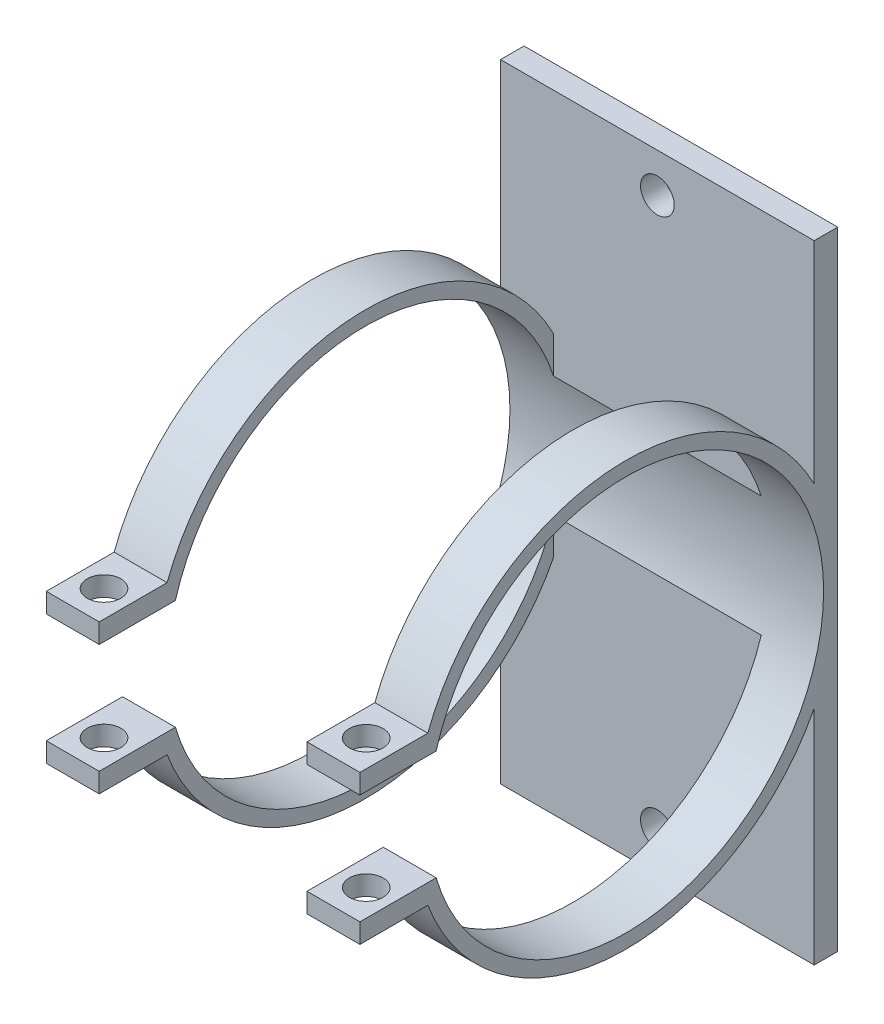
ISO-10303-21;
HEADER;
FILE_DESCRIPTION(('STEP AP214'),'2;1');
FILE_NAME('part.step','',(''),(''),'','','');
FILE_SCHEMA(('AUTOMOTIVE_DESIGN { 1 0 10303 214 1 1 1 1 }'));
ENDSEC;
DATA;
#1=APPLICATION_CONTEXT('core data for automotive mechanical design processes');
#2=APPLICATION_PROTOCOL_DEFINITION('international standard','automotive_design',2000,#1);
#3=PRODUCT_CONTEXT('',#1,'mechanical');
#4=PRODUCT('Part','Part','',(#3));
#5=PRODUCT_RELATED_PRODUCT_CATEGORY('part','',(#4));
#6=PRODUCT_DEFINITION_FORMATION('','',#4);
#7=PRODUCT_DEFINITION_CONTEXT('part definition',#1,'design');
#8=PRODUCT_DEFINITION('design','',#6,#7);
#9=PRODUCT_DEFINITION_SHAPE('','',#8);
#10=(LENGTH_UNIT() NAMED_UNIT(*) SI_UNIT(.MILLI.,.METRE.));
#11=(NAMED_UNIT(*) PLANE_ANGLE_UNIT() SI_UNIT($,.RADIAN.));
#12=(NAMED_UNIT(*) SI_UNIT($,.STERADIAN.) SOLID_ANGLE_UNIT());
#13=UNCERTAINTY_MEASURE_WITH_UNIT(LENGTH_MEASURE(1.E-05),#10,'distance_accuracy_value','');
#14=(GEOMETRIC_REPRESENTATION_CONTEXT(3) GLOBAL_UNCERTAINTY_ASSIGNED_CONTEXT((#13)) GLOBAL_UNIT_ASSIGNED_CONTEXT((#10,
#11,#12)) REPRESENTATION_CONTEXT('',''));
#15=CARTESIAN_POINT('',(0.,0.,0.));
#16=DIRECTION('',(0.,0.,1.));
#17=DIRECTION('',(1.,0.,0.));
#18=AXIS2_PLACEMENT_3D('',#15,#16,#17);
#19=CARTESIAN_POINT('',(121.416821240045,47.7428456543323,51.2082630521068));
#20=DIRECTION('',(0.,-1.,0.));
#21=DIRECTION('',(0.,0.,-1.));
#22=AXIS2_PLACEMENT_3D('',#19,#20,#21);
#23=PLANE('',#22);
#24=CARTESIAN_POINT('',(36.625,47.7428456543323,56.7542231600176));
#25=DIRECTION('',(0.,-1.,0.));
#26=DIRECTION('',(0.,0.,-1.));
#27=AXIS2_PLACEMENT_3D('',#24,#25,#26);
#28=CIRCLE('',#27,2.15);
#29=CARTESIAN_POINT('',(36.625,47.7428456543323,54.6042231600176));
#30=VERTEX_POINT('',#29);
#31=EDGE_CURVE('E331',#30,#30,#28,.T.);
#32=ORIENTED_EDGE('',*,*,#31,.F.);
#33=EDGE_LOOP('',(#32));
#34=FACE_BOUND('',#33,.T.);
#35=DIRECTION('',(0.,0.,1.));
#36=VECTOR('',#35,1.);
#37=CARTESIAN_POINT('',(33.25,47.7428456543323,51.2082630521068));
#38=LINE('',#37,#36);
#39=CARTESIAN_POINT('',(33.25,47.7428456543323,51.2082630521068));
#40=VERTEX_POINT('',#39);
#41=CARTESIAN_POINT('',(33.25,47.7428456543323,60.9319192282131));
#42=VERTEX_POINT('',#41);
#43=EDGE_CURVE('E379',#40,#42,#38,.T.);
#44=ORIENTED_EDGE('',*,*,#43,.F.);
#45=DIRECTION('',(-1.,0.,0.));
#46=VECTOR('',#45,1.);
#47=CARTESIAN_POINT('',(121.416821240045,47.7428456543323,51.2082630521068));
#48=LINE('',#47,#46);
#49=CARTESIAN_POINT('',(40.,47.7428456543323,51.2082630521068));
#50=VERTEX_POINT('',#49);
#51=EDGE_CURVE('E483',#50,#40,#48,.T.);
#52=ORIENTED_EDGE('',*,*,#51,.F.);
#53=DIRECTION('',(0.,0.,-1.));
#54=VECTOR('',#53,1.);
#55=CARTESIAN_POINT('',(40.,47.7428456543323,51.2082630521068));
#56=LINE('',#55,#54);
#57=CARTESIAN_POINT('',(40.,47.7428456543323,60.9319192282131));
#58=VERTEX_POINT('',#57);
#59=EDGE_CURVE('E254',#58,#50,#56,.T.);
#60=ORIENTED_EDGE('',*,*,#59,.F.);
#61=DIRECTION('',(-1.,0.,0.));
#62=VECTOR('',#61,1.);
#63=CARTESIAN_POINT('',(121.416821240045,47.7428456543323,60.9319192282131));
#64=LINE('',#63,#62);
#65=EDGE_CURVE('E479',#58,#42,#64,.T.);
#66=ORIENTED_EDGE('',*,*,#65,.T.);
#67=EDGE_LOOP('',(#44,#52,#60,#66));
#68=FACE_BOUND('',#67,.T.);
#69=ADVANCED_FACE('F43',(#34,#68),#23,.T.);
#70=CARTESIAN_POINT('',(121.416821240045,47.7428456543323,60.9319192282131));
#71=DIRECTION('',(0.,0.,1.));
#72=DIRECTION('',(1.,0.,0.));
#73=AXIS2_PLACEMENT_3D('',#70,#71,#72);
#74=PLANE('',#73);
#75=DIRECTION('',(0.,1.,0.));
#76=VECTOR('',#75,1.);
#77=CARTESIAN_POINT('',(33.25,67.7428456543323,60.9319192282131));
#78=LINE('',#77,#76);
#79=CARTESIAN_POINT('',(33.25,50.2428456543322,60.9319192282131));
#80=VERTEX_POINT('',#79);
#81=EDGE_CURVE('E344',#42,#80,#78,.T.);
#82=ORIENTED_EDGE('',*,*,#81,.F.);
#83=ORIENTED_EDGE('',*,*,#65,.F.);
#84=DIRECTION('',(0.,-1.,0.));
#85=VECTOR('',#84,1.);
#86=CARTESIAN_POINT('',(40.,47.7428456543323,60.9319192282131));
#87=LINE('',#86,#85);
#88=CARTESIAN_POINT('',(40.,50.2428456543323,60.9319192282131));
#89=VERTEX_POINT('',#88);
#90=EDGE_CURVE('E395',#89,#58,#87,.T.);
#91=ORIENTED_EDGE('',*,*,#90,.F.);
#92=DIRECTION('',(-1.,0.,0.));
#93=VECTOR('',#92,1.);
#94=CARTESIAN_POINT('',(121.416821240045,50.2428456543323,60.9319192282131));
#95=LINE('',#94,#93);
#96=EDGE_CURVE('E474',#89,#80,#95,.T.);
#97=ORIENTED_EDGE('',*,*,#96,.T.);
#98=EDGE_LOOP('',(#82,#83,#91,#97));
#99=FACE_BOUND('',#98,.T.);
#100=ADVANCED_FACE('F533',(#99),#74,.T.);
#101=CARTESIAN_POINT('',(121.416821240045,50.2428456543323,60.9319192282131));
#102=DIRECTION('',(0.,1.,0.));
#103=DIRECTION('',(0.,0.,1.));
#104=AXIS2_PLACEMENT_3D('',#101,#102,#103);
#105=PLANE('',#104);
#106=CARTESIAN_POINT('',(36.625,50.2428456543323,56.7542231600176));
#107=DIRECTION('',(0.,1.,0.));
#108=DIRECTION('',(0.,0.,1.));
#109=AXIS2_PLACEMENT_3D('',#106,#107,#108);
#110=CIRCLE('',#109,2.15);
#111=CARTESIAN_POINT('',(36.625,50.2428456543323,58.9042231600176));
#112=VERTEX_POINT('',#111);
#113=EDGE_CURVE('E682',#112,#112,#110,.T.);
#114=ORIENTED_EDGE('',*,*,#113,.F.);
#115=EDGE_LOOP('',(#114));
#116=FACE_BOUND('',#115,.T.);
#117=DIRECTION('',(0.,0.,-1.));
#118=VECTOR('',#117,1.);
#119=CARTESIAN_POINT('',(33.25,50.2428456543323,60.9319192282131));
#120=LINE('',#119,#118);
#121=CARTESIAN_POINT('',(33.25,50.2428456543322,52.2735039122002));
#122=VERTEX_POINT('',#121);
#123=EDGE_CURVE('E385',#80,#122,#120,.T.);
#124=ORIENTED_EDGE('',*,*,#123,.F.);
#125=ORIENTED_EDGE('',*,*,#96,.F.);
#126=DIRECTION('',(0.,0.,1.));
#127=VECTOR('',#126,1.);
#128=CARTESIAN_POINT('',(40.,50.2428456543323,60.9319192282131));
#129=LINE('',#128,#127);
#130=CARTESIAN_POINT('',(40.,50.2428456543322,52.2735039122002));
#131=VERTEX_POINT('',#130);
#132=EDGE_CURVE('E398',#131,#89,#129,.T.);
#133=ORIENTED_EDGE('',*,*,#132,.F.);
#134=DIRECTION('',(-1.,0.,0.));
#135=VECTOR('',#134,1.);
#136=CARTESIAN_POINT('',(121.416821240045,50.2428456543322,52.2735039122002));
#137=LINE('',#136,#135);
#138=EDGE_CURVE('E470',#131,#122,#137,.T.);
#139=ORIENTED_EDGE('',*,*,#138,.T.);
#140=EDGE_LOOP('',(#124,#125,#133,#139));
#141=FACE_BOUND('',#140,.T.);
#142=ADVANCED_FACE('F537',(#116,#141),#105,.T.);
#143=CARTESIAN_POINT('',(121.416821240045,40.7428456543323,27.));
#144=DIRECTION('',(-1.,0.,0.));
#145=DIRECTION('',(0.,0.,1.));
#146=AXIS2_PLACEMENT_3D('',#143,#144,#145);
#147=CYLINDRICAL_SURFACE('',#146,27.);
#148=DIRECTION('',(-1.,0.,0.));
#149=VECTOR('',#148,1.);
#150=CARTESIAN_POINT('',(121.416821240045,53.1121625311852,3.));
#151=LINE('',#150,#149);
#152=CARTESIAN_POINT('',(33.25,53.1121625311852,3.));
#153=VERTEX_POINT('',#152);
#154=CARTESIAN_POINT('',(40.,53.1121625311852,3.));
#155=VERTEX_POINT('',#154);
#156=EDGE_CURVE('E248',#153,#155,#151,.F.);
#157=ORIENTED_EDGE('',*,*,#156,.F.);
#158=CARTESIAN_POINT('',(33.25,40.7428456543323,27.));
#159=DIRECTION('',(1.,0.,0.));
#160=DIRECTION('',(0.,1.,0.));
#161=AXIS2_PLACEMENT_3D('',#158,#159,#160);
#162=CIRCLE('',#161,27.);
#163=EDGE_CURVE('E382',#122,#153,#162,.F.);
#164=ORIENTED_EDGE('',*,*,#163,.F.);
#165=ORIENTED_EDGE('',*,*,#138,.F.);
#166=CARTESIAN_POINT('',(40.,40.7428456543323,27.));
#167=DIRECTION('',(-1.,0.,0.));
#168=DIRECTION('',(0.,0.,1.));
#169=AXIS2_PLACEMENT_3D('',#166,#167,#168);
#170=CIRCLE('',#169,27.);
#171=EDGE_CURVE('E402',#155,#131,#170,.F.);
#172=ORIENTED_EDGE('',*,*,#171,.F.);
#173=EDGE_LOOP('',(#157,#164,#165,#172));
#174=FACE_BOUND('',#173,.T.);
#175=ADVANCED_FACE('F542',(#174),#147,.T.);
#176=CARTESIAN_POINT('',(33.25,40.7428456543323,27.));
#177=DIRECTION('',(1.,0.,0.));
#178=DIRECTION('',(0.,1.,0.));
#179=AXIS2_PLACEMENT_3D('',#176,#177,#178);
#180=CIRCLE('',#179,27.);
#181=CARTESIAN_POINT('',(33.25,28.3735287774793,3.));
#182=VERTEX_POINT('',#181);
#183=CARTESIAN_POINT('',(33.25,31.2428456543323,52.2735039122002));
#184=VERTEX_POINT('',#183);
#185=EDGE_CURVE('E369',#182,#184,#180,.F.);
#186=ORIENTED_EDGE('',*,*,#185,.F.);
#187=DIRECTION('',(-1.,0.,0.));
#188=VECTOR('',#187,1.);
#189=CARTESIAN_POINT('',(121.416821240045,28.3735287774793,3.));
#190=LINE('',#189,#188);
#191=CARTESIAN_POINT('',(40.,28.3735287774793,3.));
#192=VERTEX_POINT('',#191);
#193=EDGE_CURVE('E252',#192,#182,#190,.T.);
#194=ORIENTED_EDGE('',*,*,#193,.F.);
#195=CARTESIAN_POINT('',(40.,31.2428456543323,52.2735039122002));
#196=VERTEX_POINT('',#195);
#197=EDGE_CURVE('E403',#196,#192,#170,.F.);
#198=ORIENTED_EDGE('',*,*,#197,.F.);
#199=DIRECTION('',(-1.,0.,0.));
#200=VECTOR('',#199,1.);
#201=CARTESIAN_POINT('',(121.416821240045,31.2428456543323,52.2735039122002));
#202=LINE('',#201,#200);
#203=EDGE_CURVE('E465',#196,#184,#202,.T.);
#204=ORIENTED_EDGE('',*,*,#203,.T.);
#205=EDGE_LOOP('',(#186,#194,#198,#204));
#206=FACE_BOUND('',#205,.T.);
#207=ADVANCED_FACE('F574',(#206),#147,.T.);
#208=CARTESIAN_POINT('',(121.416821240045,33.7428456543323,51.2082630521068));
#209=DIRECTION('',(0.,1.,0.));
#210=DIRECTION('',(0.,0.,1.));
#211=AXIS2_PLACEMENT_3D('',#208,#209,#210);
#212=PLANE('',#211);
#213=CARTESIAN_POINT('',(36.625,33.7428456543323,56.7542231600177));
#214=DIRECTION('',(0.,1.,0.));
#215=DIRECTION('',(0.,0.,1.));
#216=AXIS2_PLACEMENT_3D('',#213,#214,#215);
#217=CIRCLE('',#216,2.15);
#218=CARTESIAN_POINT('',(36.625,33.7428456543323,58.9042231600177));
#219=VERTEX_POINT('',#218);
#220=EDGE_CURVE('E337',#219,#219,#217,.T.);
#221=ORIENTED_EDGE('',*,*,#220,.F.);
#222=EDGE_LOOP('',(#221));
#223=FACE_BOUND('',#222,.T.);
#224=DIRECTION('',(0.,0.,-1.));
#225=VECTOR('',#224,1.);
#226=CARTESIAN_POINT('',(33.25,33.7428456543323,51.2082630521068));
#227=LINE('',#226,#225);
#228=CARTESIAN_POINT('',(33.25,33.7428456543323,60.9319192282131));
#229=VERTEX_POINT('',#228);
#230=CARTESIAN_POINT('',(33.25,33.7428456543323,51.2082630521068));
#231=VERTEX_POINT('',#230);
#232=EDGE_CURVE('E372',#229,#231,#227,.T.);
#233=ORIENTED_EDGE('',*,*,#232,.F.);
#234=DIRECTION('',(-1.,0.,0.));
#235=VECTOR('',#234,1.);
#236=CARTESIAN_POINT('',(121.416821240045,33.7428456543323,60.9319192282131));
#237=LINE('',#236,#235);
#238=CARTESIAN_POINT('',(40.,33.7428456543323,60.9319192282131));
#239=VERTEX_POINT('',#238);
#240=EDGE_CURVE('E455',#239,#229,#237,.T.);
#241=ORIENTED_EDGE('',*,*,#240,.F.);
#242=DIRECTION('',(0.,0.,1.));
#243=VECTOR('',#242,1.);
#244=CARTESIAN_POINT('',(40.,33.7428456543323,51.2082630521068));
#245=LINE('',#244,#243);
#246=CARTESIAN_POINT('',(40.,33.7428456543323,51.2082630521068));
#247=VERTEX_POINT('',#246);
#248=EDGE_CURVE('E413',#247,#239,#245,.T.);
#249=ORIENTED_EDGE('',*,*,#248,.F.);
#250=DIRECTION('',(-1.,0.,0.));
#251=VECTOR('',#250,1.);
#252=CARTESIAN_POINT('',(121.416821240045,33.7428456543323,51.2082630521068));
#253=LINE('',#252,#251);
#254=EDGE_CURVE('E399',#247,#231,#253,.T.);
#255=ORIENTED_EDGE('',*,*,#254,.T.);
#256=EDGE_LOOP('',(#233,#241,#249,#255));
#257=FACE_BOUND('',#256,.T.);
#258=ADVANCED_FACE('F621',(#223,#257),#212,.T.);
#259=CARTESIAN_POINT('',(121.416821240045,33.7428456543323,60.9319192282131));
#260=DIRECTION('',(0.,0.,1.));
#261=DIRECTION('',(1.,0.,0.));
#262=AXIS2_PLACEMENT_3D('',#259,#260,#261);
#263=PLANE('',#262);
#264=CARTESIAN_POINT('',(33.25,31.2428456543323,60.9319192282131));
#265=VERTEX_POINT('',#264);
#266=EDGE_CURVE('E347',#265,#229,#78,.T.);
#267=ORIENTED_EDGE('',*,*,#266,.F.);
#268=DIRECTION('',(-1.,0.,0.));
#269=VECTOR('',#268,1.);
#270=CARTESIAN_POINT('',(121.416821240045,31.2428456543323,60.9319192282131));
#271=LINE('',#270,#269);
#272=CARTESIAN_POINT('',(40.,31.2428456543323,60.9319192282131));
#273=VERTEX_POINT('',#272);
#274=EDGE_CURVE('E460',#273,#265,#271,.T.);
#275=ORIENTED_EDGE('',*,*,#274,.F.);
#276=DIRECTION('',(0.,-1.,0.));
#277=VECTOR('',#276,1.);
#278=CARTESIAN_POINT('',(40.,33.7428456543323,60.9319192282131));
#279=LINE('',#278,#277);
#280=EDGE_CURVE('E410',#239,#273,#279,.T.);
#281=ORIENTED_EDGE('',*,*,#280,.F.);
#282=ORIENTED_EDGE('',*,*,#240,.T.);
#283=EDGE_LOOP('',(#267,#275,#281,#282));
#284=FACE_BOUND('',#283,.T.);
#285=ADVANCED_FACE('F586',(#284),#263,.T.);
#286=CARTESIAN_POINT('',(121.416821240045,31.2428456543323,60.9319192282131));
#287=DIRECTION('',(0.,-1.,0.));
#288=DIRECTION('',(0.,0.,-1.));
#289=AXIS2_PLACEMENT_3D('',#286,#287,#288);
#290=PLANE('',#289);
#291=CARTESIAN_POINT('',(36.625,31.2428456543323,56.7542231600177));
#292=DIRECTION('',(0.,-1.,0.));
#293=DIRECTION('',(0.,0.,-1.));
#294=AXIS2_PLACEMENT_3D('',#291,#292,#293);
#295=CIRCLE('',#294,2.15);
#296=CARTESIAN_POINT('',(36.625,31.2428456543323,54.6042231600177));
#297=VERTEX_POINT('',#296);
#298=EDGE_CURVE('E47',#297,#297,#295,.T.);
#299=ORIENTED_EDGE('',*,*,#298,.F.);
#300=EDGE_LOOP('',(#299));
#301=FACE_BOUND('',#300,.T.);
#302=DIRECTION('',(0.,0.,1.));
#303=VECTOR('',#302,1.);
#304=CARTESIAN_POINT('',(33.25,31.2428456543323,60.9319192282131));
#305=LINE('',#304,#303);
#306=EDGE_CURVE('E11',#184,#265,#305,.T.);
#307=ORIENTED_EDGE('',*,*,#306,.F.);
#308=ORIENTED_EDGE('',*,*,#203,.F.);
#309=DIRECTION('',(0.,0.,-1.));
#310=VECTOR('',#309,1.);
#311=CARTESIAN_POINT('',(40.,31.2428456543323,60.9319192282131));
#312=LINE('',#311,#310);
#313=EDGE_CURVE('E407',#273,#196,#312,.T.);
#314=ORIENTED_EDGE('',*,*,#313,.F.);
#315=ORIENTED_EDGE('',*,*,#274,.T.);
#316=EDGE_LOOP('',(#307,#308,#314,#315));
#317=FACE_BOUND('',#316,.T.);
#318=ADVANCED_FACE('F581',(#301,#317),#290,.T.);
#319=CARTESIAN_POINT('',(0.,0.,3.));
#320=DIRECTION('',(0.,0.,-1.));
#321=DIRECTION('',(-1.,0.,0.));
#322=AXIS2_PLACEMENT_3D('',#319,#320,#321);
#323=PLANE('',#322);
#324=CARTESIAN_POINT('',(20.,5.,3.));
#325=DIRECTION('',(0.,0.,1.));
#326=DIRECTION('',(1.,0.,0.));
#327=AXIS2_PLACEMENT_3D('',#324,#325,#326);
#328=CIRCLE('',#327,2.15);
#329=CARTESIAN_POINT('',(22.15,5.,3.));
#330=VERTEX_POINT('',#329);
#331=EDGE_CURVE('E261',#330,#330,#328,.T.);
#332=ORIENTED_EDGE('',*,*,#331,.F.);
#333=EDGE_LOOP('',(#332));
#334=FACE_BOUND('',#333,.T.);
#335=ORIENTED_EDGE('',*,*,#193,.T.);
#336=DIRECTION('',(0.,1.,0.));
#337=VECTOR('',#336,1.);
#338=CARTESIAN_POINT('',(33.25,67.7428456543323,3.));
#339=LINE('',#338,#337);
#340=CARTESIAN_POINT('',(33.25,33.0590965694128,3.));
#341=VERTEX_POINT('',#340);
#342=EDGE_CURVE('E353',#182,#341,#339,.T.);
#343=ORIENTED_EDGE('',*,*,#342,.T.);
#344=DIRECTION('',(-1.,0.,0.));
#345=VECTOR('',#344,1.);
#346=CARTESIAN_POINT('',(121.416821240045,33.0590965694128,3.));
#347=LINE('',#346,#345);
#348=CARTESIAN_POINT('',(6.75000000000001,33.0590965694128,3.));
#349=VERTEX_POINT('',#348);
#350=EDGE_CURVE('E391',#341,#349,#347,.T.);
#351=ORIENTED_EDGE('',*,*,#350,.T.);
#352=DIRECTION('',(0.,-1.,0.));
#353=VECTOR('',#352,1.);
#354=CARTESIAN_POINT('',(6.75,67.7428456543323,3.));
#355=LINE('',#354,#353);
#356=CARTESIAN_POINT('',(6.75000000000001,28.3735287774793,3.));
#357=VERTEX_POINT('',#356);
#358=EDGE_CURVE('E239',#349,#357,#355,.T.);
#359=ORIENTED_EDGE('',*,*,#358,.T.);
#360=CARTESIAN_POINT('',(0.,28.3735287774793,3.));
#361=VERTEX_POINT('',#360);
#362=EDGE_CURVE('E247',#357,#361,#190,.T.);
#363=ORIENTED_EDGE('',*,*,#362,.T.);
#364=DIRECTION('',(0.,-1.,0.));
#365=VECTOR('',#364,1.);
#366=CARTESIAN_POINT('',(0.,0.,3.));
#367=LINE('',#366,#365);
#368=CARTESIAN_POINT('',(0.,0.,3.));
#369=VERTEX_POINT('',#368);
#370=EDGE_CURVE('E280',#361,#369,#367,.T.);
#371=ORIENTED_EDGE('',*,*,#370,.T.);
#372=DIRECTION('',(1.,0.,0.));
#373=VECTOR('',#372,1.);
#374=CARTESIAN_POINT('',(0.,0.,3.));
#375=LINE('',#374,#373);
#376=CARTESIAN_POINT('',(40.,0.,3.));
#377=VERTEX_POINT('',#376);
#378=EDGE_CURVE('E279',#369,#377,#375,.T.);
#379=ORIENTED_EDGE('',*,*,#378,.T.);
#380=DIRECTION('',(0.,1.,0.));
#381=VECTOR('',#380,1.);
#382=CARTESIAN_POINT('',(40.,0.,3.));
#383=LINE('',#382,#381);
#384=EDGE_CURVE('E284',#377,#192,#383,.T.);
#385=ORIENTED_EDGE('',*,*,#384,.T.);
#386=EDGE_LOOP('',(#335,#343,#351,#359,#363,#371,#379,#385));
#387=FACE_BOUND('',#386,.T.);
#388=ADVANCED_FACE('F552',(#334,#387),#323,.F.);
#389=CARTESIAN_POINT('',(33.25,48.4265947392517,3.));
#390=VERTEX_POINT('',#389);
#391=EDGE_CURVE('E354',#390,#153,#339,.T.);
#392=ORIENTED_EDGE('',*,*,#391,.T.);
#393=ORIENTED_EDGE('',*,*,#156,.T.);
#394=CARTESIAN_POINT('',(40.,80.,3.));
#395=VERTEX_POINT('',#394);
#396=EDGE_CURVE('E283',#155,#395,#383,.T.);
#397=ORIENTED_EDGE('',*,*,#396,.T.);
#398=DIRECTION('',(-1.,0.,0.));
#399=VECTOR('',#398,1.);
#400=CARTESIAN_POINT('',(0.,80.,3.));
#401=LINE('',#400,#399);
#402=CARTESIAN_POINT('',(0.,80.,3.));
#403=VERTEX_POINT('',#402);
#404=EDGE_CURVE('E287',#395,#403,#401,.T.);
#405=ORIENTED_EDGE('',*,*,#404,.T.);
#406=CARTESIAN_POINT('',(0.,53.1121625311852,3.));
#407=VERTEX_POINT('',#406);
#408=EDGE_CURVE('E245',#403,#407,#367,.T.);
#409=ORIENTED_EDGE('',*,*,#408,.T.);
#410=CARTESIAN_POINT('',(6.75,53.1121625311852,3.));
#411=VERTEX_POINT('',#410);
#412=EDGE_CURVE('E224',#407,#411,#151,.F.);
#413=ORIENTED_EDGE('',*,*,#412,.T.);
#414=CARTESIAN_POINT('',(6.75000000000001,48.4265947392517,3.));
#415=VERTEX_POINT('',#414);
#416=EDGE_CURVE('E232',#411,#415,#355,.T.);
#417=ORIENTED_EDGE('',*,*,#416,.T.);
#418=DIRECTION('',(-1.,0.,0.));
#419=VECTOR('',#418,1.);
#420=CARTESIAN_POINT('',(121.416821240045,48.4265947392517,3.));
#421=LINE('',#420,#419);
#422=EDGE_CURVE('E388',#415,#390,#421,.F.);
#423=ORIENTED_EDGE('',*,*,#422,.T.);
#424=EDGE_LOOP('',(#392,#393,#397,#405,#409,#413,#417,#423));
#425=FACE_BOUND('',#424,.T.);
#426=CARTESIAN_POINT('',(20.,75.,3.));
#427=DIRECTION('',(0.,0.,1.));
#428=DIRECTION('',(1.,0.,0.));
#429=AXIS2_PLACEMENT_3D('',#426,#427,#428);
#430=CIRCLE('',#429,2.15);
#431=CARTESIAN_POINT('',(22.15,75.,3.));
#432=VERTEX_POINT('',#431);
#433=EDGE_CURVE('E269',#432,#432,#430,.T.);
#434=ORIENTED_EDGE('',*,*,#433,.F.);
#435=EDGE_LOOP('',(#434));
#436=FACE_BOUND('',#435,.T.);
#437=ADVANCED_FACE('F242',(#425,#436),#323,.F.);
#438=CARTESIAN_POINT('',(0.,0.,0.));
#439=DIRECTION('',(0.,0.,-1.));
#440=DIRECTION('',(-1.,0.,0.));
#441=AXIS2_PLACEMENT_3D('',#438,#439,#440);
#442=PLANE('',#441);
#443=DIRECTION('',(1.,0.,0.));
#444=VECTOR('',#443,1.);
#445=CARTESIAN_POINT('',(0.,0.,0.));
#446=LINE('',#445,#444);
#447=CARTESIAN_POINT('',(0.,0.,0.));
#448=VERTEX_POINT('',#447);
#449=CARTESIAN_POINT('',(40.,0.,0.));
#450=VERTEX_POINT('',#449);
#451=EDGE_CURVE('E293',#448,#450,#446,.T.);
#452=ORIENTED_EDGE('',*,*,#451,.F.);
#453=DIRECTION('',(0.,-1.,0.));
#454=VECTOR('',#453,1.);
#455=CARTESIAN_POINT('',(0.,0.,0.));
#456=LINE('',#455,#454);
#457=CARTESIAN_POINT('',(0.,80.,0.));
#458=VERTEX_POINT('',#457);
#459=EDGE_CURVE('E273',#458,#448,#456,.T.);
#460=ORIENTED_EDGE('',*,*,#459,.F.);
#461=DIRECTION('',(-1.,0.,0.));
#462=VECTOR('',#461,1.);
#463=CARTESIAN_POINT('',(0.,80.,0.));
#464=LINE('',#463,#462);
#465=CARTESIAN_POINT('',(40.,80.,0.));
#466=VERTEX_POINT('',#465);
#467=EDGE_CURVE('E299',#466,#458,#464,.T.);
#468=ORIENTED_EDGE('',*,*,#467,.F.);
#469=DIRECTION('',(0.,1.,0.));
#470=VECTOR('',#469,1.);
#471=CARTESIAN_POINT('',(40.,0.,0.));
#472=LINE('',#471,#470);
#473=EDGE_CURVE('E296',#450,#466,#472,.T.);
#474=ORIENTED_EDGE('',*,*,#473,.F.);
#475=EDGE_LOOP('',(#452,#460,#468,#474));
#476=FACE_BOUND('',#475,.T.);
#477=CARTESIAN_POINT('',(20.,5.,0.));
#478=DIRECTION('',(0.,0.,1.));
#479=DIRECTION('',(1.,0.,0.));
#480=AXIS2_PLACEMENT_3D('',#477,#478,#479);
#481=CIRCLE('',#480,2.15);
#482=CARTESIAN_POINT('',(22.15,5.,0.));
#483=VERTEX_POINT('',#482);
#484=EDGE_CURVE('E260',#483,#483,#481,.T.);
#485=ORIENTED_EDGE('',*,*,#484,.T.);
#486=EDGE_LOOP('',(#485));
#487=FACE_BOUND('',#486,.T.);
#488=CARTESIAN_POINT('',(20.,75.,0.));
#489=DIRECTION('',(0.,0.,1.));
#490=DIRECTION('',(1.,0.,0.));
#491=AXIS2_PLACEMENT_3D('',#488,#489,#490);
#492=CIRCLE('',#491,2.15);
#493=CARTESIAN_POINT('',(22.15,75.,0.));
#494=VERTEX_POINT('',#493);
#495=EDGE_CURVE('E265',#494,#494,#492,.T.);
#496=ORIENTED_EDGE('',*,*,#495,.T.);
#497=EDGE_LOOP('',(#496));
#498=FACE_BOUND('',#497,.T.);
#499=ADVANCED_FACE('F567',(#476,#487,#498),#442,.T.);
#500=CARTESIAN_POINT('',(0.,0.,3.));
#501=DIRECTION('',(1.,0.,0.));
#502=DIRECTION('',(0.,0.,-1.));
#503=AXIS2_PLACEMENT_3D('',#500,#501,#502);
#504=PLANE('',#503);
#505=CARTESIAN_POINT('',(0.,40.7428456543323,27.));
#506=DIRECTION('',(1.,0.,0.));
#507=DIRECTION('',(0.,0.,1.));
#508=AXIS2_PLACEMENT_3D('',#505,#506,#507);
#509=CIRCLE('',#508,25.2);
#510=CARTESIAN_POINT('',(0.,33.7428456543323,51.2082630521068));
#511=VERTEX_POINT('',#510);
#512=CARTESIAN_POINT('',(0.,47.7428456543323,51.2082630521068));
#513=VERTEX_POINT('',#512);
#514=EDGE_CURVE('E394',#511,#513,#509,.T.);
#515=ORIENTED_EDGE('',*,*,#514,.T.);
#516=DIRECTION('',(0.,0.,1.));
#517=VECTOR('',#516,1.);
#518=CARTESIAN_POINT('',(0.,47.7428456543323,51.2082630521068));
#519=LINE('',#518,#517);
#520=CARTESIAN_POINT('',(0.,47.7428456543323,60.9319192282131));
#521=VERTEX_POINT('',#520);
#522=EDGE_CURVE('E422',#513,#521,#519,.T.);
#523=ORIENTED_EDGE('',*,*,#522,.T.);
#524=DIRECTION('',(0.,1.,0.));
#525=VECTOR('',#524,1.);
#526=CARTESIAN_POINT('',(0.,47.7428456543323,60.9319192282131));
#527=LINE('',#526,#525);
#528=CARTESIAN_POINT('',(0.,50.2428456543323,60.9319192282131));
#529=VERTEX_POINT('',#528);
#530=EDGE_CURVE('E426',#521,#529,#527,.T.);
#531=ORIENTED_EDGE('',*,*,#530,.T.);
#532=DIRECTION('',(0.,0.,-1.));
#533=VECTOR('',#532,1.);
#534=CARTESIAN_POINT('',(0.,50.2428456543323,60.9319192282131));
#535=LINE('',#534,#533);
#536=CARTESIAN_POINT('',(0.,50.2428456543322,52.2735039122002));
#537=VERTEX_POINT('',#536);
#538=EDGE_CURVE('E430',#529,#537,#535,.T.);
#539=ORIENTED_EDGE('',*,*,#538,.T.);
#540=CARTESIAN_POINT('',(0.,40.7428456543323,27.));
#541=DIRECTION('',(-1.,0.,0.));
#542=DIRECTION('',(0.,0.,1.));
#543=AXIS2_PLACEMENT_3D('',#540,#541,#542);
#544=CIRCLE('',#543,27.);
#545=EDGE_CURVE('E435',#537,#407,#544,.T.);
#546=ORIENTED_EDGE('',*,*,#545,.T.);
#547=ORIENTED_EDGE('',*,*,#408,.F.);
#548=DIRECTION('',(0.,0.,-1.));
#549=VECTOR('',#548,1.);
#550=CARTESIAN_POINT('',(0.,80.,3.));
#551=LINE('',#550,#549);
#552=EDGE_CURVE('E290',#403,#458,#551,.T.);
#553=ORIENTED_EDGE('',*,*,#552,.T.);
#554=ORIENTED_EDGE('',*,*,#459,.T.);
#555=DIRECTION('',(0.,0.,-1.));
#556=VECTOR('',#555,1.);
#557=CARTESIAN_POINT('',(0.,0.,3.));
#558=LINE('',#557,#556);
#559=EDGE_CURVE('E313',#369,#448,#558,.T.);
#560=ORIENTED_EDGE('',*,*,#559,.F.);
#561=ORIENTED_EDGE('',*,*,#370,.F.);
#562=CARTESIAN_POINT('',(0.,31.2428456543323,52.2735039122002));
#563=VERTEX_POINT('',#562);
#564=EDGE_CURVE('E434',#361,#563,#544,.T.);
#565=ORIENTED_EDGE('',*,*,#564,.T.);
#566=DIRECTION('',(0.,0.,1.));
#567=VECTOR('',#566,1.);
#568=CARTESIAN_POINT('',(0.,31.2428456543323,60.9319192282131));
#569=LINE('',#568,#567);
#570=CARTESIAN_POINT('',(0.,31.2428456543323,60.9319192282131));
#571=VERTEX_POINT('',#570);
#572=EDGE_CURVE('E438',#563,#571,#569,.T.);
#573=ORIENTED_EDGE('',*,*,#572,.T.);
#574=DIRECTION('',(0.,1.,0.));
#575=VECTOR('',#574,1.);
#576=CARTESIAN_POINT('',(0.,33.7428456543323,60.9319192282131));
#577=LINE('',#576,#575);
#578=CARTESIAN_POINT('',(0.,33.7428456543323,60.9319192282131));
#579=VERTEX_POINT('',#578);
#580=EDGE_CURVE('E442',#571,#579,#577,.T.);
#581=ORIENTED_EDGE('',*,*,#580,.T.);
#582=DIRECTION('',(0.,0.,-1.));
#583=VECTOR('',#582,1.);
#584=CARTESIAN_POINT('',(0.,33.7428456543323,51.2082630521068));
#585=LINE('',#584,#583);
#586=EDGE_CURVE('E446',#579,#511,#585,.T.);
#587=ORIENTED_EDGE('',*,*,#586,.T.);
#588=EDGE_LOOP('',(#515,#523,#531,#539,#546,#547,#553,#554,#560,#561,#565,#573,#581,#587));
#589=FACE_BOUND('',#588,.T.);
#590=ADVANCED_FACE('F45',(#589),#504,.F.);
#591=CARTESIAN_POINT('',(0.,0.,3.));
#592=DIRECTION('',(0.,1.,0.));
#593=DIRECTION('',(0.,0.,1.));
#594=AXIS2_PLACEMENT_3D('',#591,#592,#593);
#595=PLANE('',#594);
#596=ORIENTED_EDGE('',*,*,#451,.T.);
#597=DIRECTION('',(0.,0.,-1.));
#598=VECTOR('',#597,1.);
#599=CARTESIAN_POINT('',(40.,0.,3.));
#600=LINE('',#599,#598);
#601=EDGE_CURVE('E309',#377,#450,#600,.T.);
#602=ORIENTED_EDGE('',*,*,#601,.F.);
#603=ORIENTED_EDGE('',*,*,#378,.F.);
#604=ORIENTED_EDGE('',*,*,#559,.T.);
#605=EDGE_LOOP('',(#596,#602,#603,#604));
#606=FACE_BOUND('',#605,.T.);
#607=ADVANCED_FACE('F559',(#606),#595,.F.);
#608=CARTESIAN_POINT('',(40.,0.,3.));
#609=DIRECTION('',(-1.,0.,0.));
#610=DIRECTION('',(0.,0.,1.));
#611=AXIS2_PLACEMENT_3D('',#608,#609,#610);
#612=PLANE('',#611);
#613=ORIENTED_EDGE('',*,*,#59,.T.);
#614=CARTESIAN_POINT('',(40.,40.7428456543323,27.));
#615=DIRECTION('',(-1.,0.,0.));
#616=DIRECTION('',(0.,0.,1.));
#617=AXIS2_PLACEMENT_3D('',#614,#615,#616);
#618=CIRCLE('',#617,25.2);
#619=EDGE_CURVE('E416',#50,#247,#618,.T.);
#620=ORIENTED_EDGE('',*,*,#619,.T.);
#621=ORIENTED_EDGE('',*,*,#248,.T.);
#622=ORIENTED_EDGE('',*,*,#280,.T.);
#623=ORIENTED_EDGE('',*,*,#313,.T.);
#624=ORIENTED_EDGE('',*,*,#197,.T.);
#625=ORIENTED_EDGE('',*,*,#384,.F.);
#626=ORIENTED_EDGE('',*,*,#601,.T.);
#627=ORIENTED_EDGE('',*,*,#473,.T.);
#628=DIRECTION('',(0.,0.,-1.));
#629=VECTOR('',#628,1.);
#630=CARTESIAN_POINT('',(40.,80.,3.));
#631=LINE('',#630,#629);
#632=EDGE_CURVE('E305',#395,#466,#631,.T.);
#633=ORIENTED_EDGE('',*,*,#632,.F.);
#634=ORIENTED_EDGE('',*,*,#396,.F.);
#635=ORIENTED_EDGE('',*,*,#171,.T.);
#636=ORIENTED_EDGE('',*,*,#132,.T.);
#637=ORIENTED_EDGE('',*,*,#90,.T.);
#638=EDGE_LOOP('',(#613,#620,#621,#622,#623,#624,#625,#626,#627,#633,#634,#635,#636,#637));
#639=FACE_BOUND('',#638,.T.);
#640=ADVANCED_FACE('F521',(#639),#612,.F.);
#641=CARTESIAN_POINT('',(0.,80.,3.));
#642=DIRECTION('',(0.,-1.,0.));
#643=DIRECTION('',(0.,0.,-1.));
#644=AXIS2_PLACEMENT_3D('',#641,#642,#643);
#645=PLANE('',#644);
#646=ORIENTED_EDGE('',*,*,#467,.T.);
#647=ORIENTED_EDGE('',*,*,#552,.F.);
#648=ORIENTED_EDGE('',*,*,#404,.F.);
#649=ORIENTED_EDGE('',*,*,#632,.T.);
#650=EDGE_LOOP('',(#646,#647,#648,#649));
#651=FACE_BOUND('',#650,.T.);
#652=ADVANCED_FACE('F934',(#651),#645,.F.);
#653=CARTESIAN_POINT('',(20.,75.,3.));
#654=DIRECTION('',(0.,0.,-1.));
#655=DIRECTION('',(-1.,0.,0.));
#656=AXIS2_PLACEMENT_3D('',#653,#654,#655);
#657=CYLINDRICAL_SURFACE('',#656,2.15);
#658=ORIENTED_EDGE('',*,*,#433,.T.);
#659=EDGE_LOOP('',(#658));
#660=FACE_BOUND('',#659,.T.);
#661=ORIENTED_EDGE('',*,*,#495,.F.);
#662=EDGE_LOOP('',(#661));
#663=FACE_BOUND('',#662,.T.);
#664=ADVANCED_FACE('F642',(#660,#663),#657,.F.);
#665=CARTESIAN_POINT('',(20.,5.,3.));
#666=DIRECTION('',(0.,0.,-1.));
#667=DIRECTION('',(-1.,0.,0.));
#668=AXIS2_PLACEMENT_3D('',#665,#666,#667);
#669=CYLINDRICAL_SURFACE('',#668,2.15);
#670=ORIENTED_EDGE('',*,*,#331,.T.);
#671=EDGE_LOOP('',(#670));
#672=FACE_BOUND('',#671,.T.);
#673=ORIENTED_EDGE('',*,*,#484,.F.);
#674=EDGE_LOOP('',(#673));
#675=FACE_BOUND('',#674,.T.);
#676=ADVANCED_FACE('F636',(#672,#675),#669,.F.);
#677=CARTESIAN_POINT('',(3.375,47.7428456543323,56.9407938421602));
#678=DIRECTION('',(0.,-1.,0.));
#679=DIRECTION('',(0.,0.,-1.));
#680=AXIS2_PLACEMENT_3D('',#677,#678,#679);
#681=CIRCLE('',#680,2.15);
#682=CARTESIAN_POINT('',(3.375,47.7428456543323,54.7907938421602));
#683=VERTEX_POINT('',#682);
#684=EDGE_CURVE('E328',#683,#683,#681,.T.);
#685=ORIENTED_EDGE('',*,*,#684,.F.);
#686=EDGE_LOOP('',(#685));
#687=FACE_BOUND('',#686,.T.);
#688=DIRECTION('',(0.,0.,-1.));
#689=VECTOR('',#688,1.);
#690=CARTESIAN_POINT('',(6.75000000000001,47.7428456543323,51.2082630521068));
#691=LINE('',#690,#689);
#692=CARTESIAN_POINT('',(6.75,47.7428456543323,60.9319192282131));
#693=VERTEX_POINT('',#692);
#694=CARTESIAN_POINT('',(6.75000000000001,47.7428456543323,51.2082630521068));
#695=VERTEX_POINT('',#694);
#696=EDGE_CURVE('E61',#693,#695,#691,.T.);
#697=ORIENTED_EDGE('',*,*,#696,.F.);
#698=EDGE_CURVE('E482',#693,#521,#64,.T.);
#699=ORIENTED_EDGE('',*,*,#698,.T.);
#700=ORIENTED_EDGE('',*,*,#522,.F.);
#701=EDGE_CURVE('E450',#695,#513,#48,.T.);
#702=ORIENTED_EDGE('',*,*,#701,.F.);
#703=EDGE_LOOP('',(#697,#699,#700,#702));
#704=FACE_BOUND('',#703,.T.);
#705=ADVANCED_FACE('F500',(#687,#704),#23,.T.);
#706=DIRECTION('',(0.,-1.,0.));
#707=VECTOR('',#706,1.);
#708=CARTESIAN_POINT('',(6.75,67.7428456543323,60.9319192282131));
#709=LINE('',#708,#707);
#710=CARTESIAN_POINT('',(6.75,50.2428456543322,60.9319192282131));
#711=VERTEX_POINT('',#710);
#712=EDGE_CURVE('E348',#711,#693,#709,.T.);
#713=ORIENTED_EDGE('',*,*,#712,.F.);
#714=EDGE_CURVE('E478',#711,#529,#95,.T.);
#715=ORIENTED_EDGE('',*,*,#714,.T.);
#716=ORIENTED_EDGE('',*,*,#530,.F.);
#717=ORIENTED_EDGE('',*,*,#698,.F.);
#718=EDGE_LOOP('',(#713,#715,#716,#717));
#719=FACE_BOUND('',#718,.T.);
#720=ADVANCED_FACE('F505',(#719),#74,.T.);
#721=CARTESIAN_POINT('',(3.375,50.2428456543322,56.9407938421602));
#722=DIRECTION('',(0.,1.,0.));
#723=DIRECTION('',(0.,0.,1.));
#724=AXIS2_PLACEMENT_3D('',#721,#722,#723);
#725=CIRCLE('',#724,2.15);
#726=CARTESIAN_POINT('',(3.375,50.2428456543322,59.0907938421602));
#727=VERTEX_POINT('',#726);
#728=EDGE_CURVE('E322',#727,#727,#725,.T.);
#729=ORIENTED_EDGE('',*,*,#728,.F.);
#730=EDGE_LOOP('',(#729));
#731=FACE_BOUND('',#730,.T.);
#732=DIRECTION('',(0.,0.,1.));
#733=VECTOR('',#732,1.);
#734=CARTESIAN_POINT('',(6.75000000000001,50.2428456543323,60.9319192282131));
#735=LINE('',#734,#733);
#736=CARTESIAN_POINT('',(6.75,50.2428456543322,52.2735039122002));
#737=VERTEX_POINT('',#736);
#738=EDGE_CURVE('E229',#737,#711,#735,.T.);
#739=ORIENTED_EDGE('',*,*,#738,.F.);
#740=EDGE_CURVE('E226',#737,#537,#137,.T.);
#741=ORIENTED_EDGE('',*,*,#740,.T.);
#742=ORIENTED_EDGE('',*,*,#538,.F.);
#743=ORIENTED_EDGE('',*,*,#714,.F.);
#744=EDGE_LOOP('',(#739,#741,#742,#743));
#745=FACE_BOUND('',#744,.T.);
#746=ADVANCED_FACE('F509',(#731,#745),#105,.T.);
#747=CARTESIAN_POINT('',(6.75000000000001,40.7428456543323,27.));
#748=DIRECTION('',(-1.,0.,0.));
#749=DIRECTION('',(0.,-1.,0.));
#750=AXIS2_PLACEMENT_3D('',#747,#748,#749);
#751=CIRCLE('',#750,27.);
#752=EDGE_CURVE('E219',#411,#737,#751,.F.);
#753=ORIENTED_EDGE('',*,*,#752,.F.);
#754=ORIENTED_EDGE('',*,*,#412,.F.);
#755=ORIENTED_EDGE('',*,*,#545,.F.);
#756=ORIENTED_EDGE('',*,*,#740,.F.);
#757=EDGE_LOOP('',(#753,#754,#755,#756));
#758=FACE_BOUND('',#757,.T.);
#759=ADVANCED_FACE('F221',(#758),#147,.T.);
#760=CARTESIAN_POINT('',(121.416821240045,40.7428456543323,27.));
#761=DIRECTION('',(-1.,0.,0.));
#762=DIRECTION('',(0.,0.,1.));
#763=AXIS2_PLACEMENT_3D('',#760,#761,#762);
#764=CYLINDRICAL_SURFACE('',#763,25.2);
#765=CARTESIAN_POINT('',(33.25,40.7428456543323,27.));
#766=DIRECTION('',(1.,0.,0.));
#767=DIRECTION('',(0.,1.,0.));
#768=AXIS2_PLACEMENT_3D('',#765,#766,#767);
#769=CIRCLE('',#768,25.2);
#770=EDGE_CURVE('E375',#231,#341,#769,.T.);
#771=ORIENTED_EDGE('',*,*,#770,.F.);
#772=ORIENTED_EDGE('',*,*,#254,.F.);
#773=ORIENTED_EDGE('',*,*,#619,.F.);
#774=ORIENTED_EDGE('',*,*,#51,.T.);
#775=EDGE_CURVE('E378',#390,#40,#769,.T.);
#776=ORIENTED_EDGE('',*,*,#775,.F.);
#777=ORIENTED_EDGE('',*,*,#422,.F.);
#778=CARTESIAN_POINT('',(6.75000000000001,40.7428456543323,27.));
#779=DIRECTION('',(-1.,0.,0.));
#780=DIRECTION('',(0.,-1.,0.));
#781=AXIS2_PLACEMENT_3D('',#778,#779,#780);
#782=CIRCLE('',#781,25.2);
#783=EDGE_CURVE('E234',#695,#415,#782,.T.);
#784=ORIENTED_EDGE('',*,*,#783,.F.);
#785=ORIENTED_EDGE('',*,*,#701,.T.);
#786=ORIENTED_EDGE('',*,*,#514,.F.);
#787=CARTESIAN_POINT('',(6.75000000000001,33.7428456543323,51.2082630521068));
#788=VERTEX_POINT('',#787);
#789=EDGE_CURVE('E454',#788,#511,#253,.T.);
#790=ORIENTED_EDGE('',*,*,#789,.F.);
#791=EDGE_CURVE('E362',#349,#788,#782,.T.);
#792=ORIENTED_EDGE('',*,*,#791,.F.);
#793=ORIENTED_EDGE('',*,*,#350,.F.);
#794=EDGE_LOOP('',(#771,#772,#773,#774,#776,#777,#784,#785,#786,#790,#792,#793));
#795=FACE_BOUND('',#794,.T.);
#796=ADVANCED_FACE('F494',(#795),#764,.F.);
#797=CARTESIAN_POINT('',(6.75000000000001,40.7428456543323,27.));
#798=DIRECTION('',(-1.,0.,0.));
#799=DIRECTION('',(0.,-1.,0.));
#800=AXIS2_PLACEMENT_3D('',#797,#798,#799);
#801=CIRCLE('',#800,27.);
#802=CARTESIAN_POINT('',(6.75000000000001,31.2428456543323,52.2735039122002));
#803=VERTEX_POINT('',#802);
#804=EDGE_CURVE('E238',#803,#357,#801,.F.);
#805=ORIENTED_EDGE('',*,*,#804,.F.);
#806=EDGE_CURVE('E469',#803,#563,#202,.T.);
#807=ORIENTED_EDGE('',*,*,#806,.T.);
#808=ORIENTED_EDGE('',*,*,#564,.F.);
#809=ORIENTED_EDGE('',*,*,#362,.F.);
#810=EDGE_LOOP('',(#805,#807,#808,#809));
#811=FACE_BOUND('',#810,.T.);
#812=ADVANCED_FACE('F612',(#811),#147,.T.);
#813=CARTESIAN_POINT('',(3.375,33.7428456543323,56.9407938421602));
#814=DIRECTION('',(0.,1.,0.));
#815=DIRECTION('',(0.,0.,1.));
#816=AXIS2_PLACEMENT_3D('',#813,#814,#815);
#817=CIRCLE('',#816,2.15);
#818=CARTESIAN_POINT('',(3.375,33.7428456543323,59.0907938421602));
#819=VERTEX_POINT('',#818);
#820=EDGE_CURVE('E321',#819,#819,#817,.T.);
#821=ORIENTED_EDGE('',*,*,#820,.F.);
#822=EDGE_LOOP('',(#821));
#823=FACE_BOUND('',#822,.T.);
#824=DIRECTION('',(0.,0.,1.));
#825=VECTOR('',#824,1.);
#826=CARTESIAN_POINT('',(6.75000000000001,33.7428456543323,51.2082630521068));
#827=LINE('',#826,#825);
#828=CARTESIAN_POINT('',(6.75,33.7428456543323,60.9319192282131));
#829=VERTEX_POINT('',#828);
#830=EDGE_CURVE('E359',#788,#829,#827,.T.);
#831=ORIENTED_EDGE('',*,*,#830,.F.);
#832=ORIENTED_EDGE('',*,*,#789,.T.);
#833=ORIENTED_EDGE('',*,*,#586,.F.);
#834=EDGE_CURVE('E459',#829,#579,#237,.T.);
#835=ORIENTED_EDGE('',*,*,#834,.F.);
#836=EDGE_LOOP('',(#831,#832,#833,#835));
#837=FACE_BOUND('',#836,.T.);
#838=ADVANCED_FACE('F607',(#823,#837),#212,.T.);
#839=CARTESIAN_POINT('',(6.75000000000001,31.2428456543323,60.9319192282131));
#840=VERTEX_POINT('',#839);
#841=EDGE_CURVE('E69',#829,#840,#709,.T.);
#842=ORIENTED_EDGE('',*,*,#841,.F.);
#843=ORIENTED_EDGE('',*,*,#834,.T.);
#844=ORIENTED_EDGE('',*,*,#580,.F.);
#845=EDGE_CURVE('E464',#840,#571,#271,.T.);
#846=ORIENTED_EDGE('',*,*,#845,.F.);
#847=EDGE_LOOP('',(#842,#843,#844,#846));
#848=FACE_BOUND('',#847,.T.);
#849=ADVANCED_FACE('F603',(#848),#263,.T.);
#850=CARTESIAN_POINT('',(3.375,31.2428456543323,56.9407938421602));
#851=DIRECTION('',(0.,-1.,0.));
#852=DIRECTION('',(0.,0.,-1.));
#853=AXIS2_PLACEMENT_3D('',#850,#851,#852);
#854=CIRCLE('',#853,2.15);
#855=CARTESIAN_POINT('',(3.375,31.2428456543323,54.7907938421602));
#856=VERTEX_POINT('',#855);
#857=EDGE_CURVE('E318',#856,#856,#854,.T.);
#858=ORIENTED_EDGE('',*,*,#857,.F.);
#859=EDGE_LOOP('',(#858));
#860=FACE_BOUND('',#859,.T.);
#861=DIRECTION('',(0.,0.,-1.));
#862=VECTOR('',#861,1.);
#863=CARTESIAN_POINT('',(6.75000000000001,31.2428456543323,60.9319192282131));
#864=LINE('',#863,#862);
#865=EDGE_CURVE('E53',#840,#803,#864,.T.);
#866=ORIENTED_EDGE('',*,*,#865,.F.);
#867=ORIENTED_EDGE('',*,*,#845,.T.);
#868=ORIENTED_EDGE('',*,*,#572,.F.);
#869=ORIENTED_EDGE('',*,*,#806,.F.);
#870=EDGE_LOOP('',(#866,#867,#868,#869));
#871=FACE_BOUND('',#870,.T.);
#872=ADVANCED_FACE('F599',(#860,#871),#290,.T.);
#873=CARTESIAN_POINT('',(6.75,67.7428456543323,-57.1518910758423));
#874=DIRECTION('',(-1.,0.,0.));
#875=DIRECTION('',(0.,-1.,0.));
#876=AXIS2_PLACEMENT_3D('',#873,#874,#875);
#877=PLANE('',#876);
#878=ORIENTED_EDGE('',*,*,#791,.T.);
#879=ORIENTED_EDGE('',*,*,#830,.T.);
#880=ORIENTED_EDGE('',*,*,#841,.T.);
#881=ORIENTED_EDGE('',*,*,#865,.T.);
#882=ORIENTED_EDGE('',*,*,#804,.T.);
#883=ORIENTED_EDGE('',*,*,#358,.F.);
#884=EDGE_LOOP('',(#878,#879,#880,#881,#882,#883));
#885=FACE_BOUND('',#884,.T.);
#886=ADVANCED_FACE('F611',(#885),#877,.F.);
#887=CARTESIAN_POINT('',(33.25,67.7428456543323,-57.1518910758423));
#888=DIRECTION('',(1.,0.,0.));
#889=DIRECTION('',(0.,1.,0.));
#890=AXIS2_PLACEMENT_3D('',#887,#888,#889);
#891=PLANE('',#890);
#892=ORIENTED_EDGE('',*,*,#770,.T.);
#893=ORIENTED_EDGE('',*,*,#342,.F.);
#894=ORIENTED_EDGE('',*,*,#185,.T.);
#895=ORIENTED_EDGE('',*,*,#306,.T.);
#896=ORIENTED_EDGE('',*,*,#266,.T.);
#897=ORIENTED_EDGE('',*,*,#232,.T.);
#898=EDGE_LOOP('',(#892,#893,#894,#895,#896,#897));
#899=FACE_BOUND('',#898,.T.);
#900=ADVANCED_FACE('F578',(#899),#891,.F.);
#901=ORIENTED_EDGE('',*,*,#123,.T.);
#902=ORIENTED_EDGE('',*,*,#163,.T.);
#903=ORIENTED_EDGE('',*,*,#391,.F.);
#904=ORIENTED_EDGE('',*,*,#775,.T.);
#905=ORIENTED_EDGE('',*,*,#43,.T.);
#906=ORIENTED_EDGE('',*,*,#81,.T.);
#907=EDGE_LOOP('',(#901,#902,#903,#904,#905,#906));
#908=FACE_BOUND('',#907,.T.);
#909=ADVANCED_FACE('F529',(#908),#891,.F.);
#910=ORIENTED_EDGE('',*,*,#738,.T.);
#911=ORIENTED_EDGE('',*,*,#712,.T.);
#912=ORIENTED_EDGE('',*,*,#696,.T.);
#913=ORIENTED_EDGE('',*,*,#783,.T.);
#914=ORIENTED_EDGE('',*,*,#416,.F.);
#915=ORIENTED_EDGE('',*,*,#752,.T.);
#916=EDGE_LOOP('',(#910,#911,#912,#913,#914,#915));
#917=FACE_BOUND('',#916,.T.);
#918=ADVANCED_FACE('F233',(#917),#877,.F.);
#919=CARTESIAN_POINT('',(3.375,0.,56.9407938421602));
#920=DIRECTION('',(0.,1.,0.));
#921=DIRECTION('',(0.,0.,1.));
#922=AXIS2_PLACEMENT_3D('',#919,#920,#921);
#923=CYLINDRICAL_SURFACE('',#922,2.15);
#924=ORIENTED_EDGE('',*,*,#820,.T.);
#925=EDGE_LOOP('',(#924));
#926=FACE_BOUND('',#925,.T.);
#927=ORIENTED_EDGE('',*,*,#857,.T.);
#928=EDGE_LOOP('',(#927));
#929=FACE_BOUND('',#928,.T.);
#930=ADVANCED_FACE('F650',(#926,#929),#923,.F.);
#931=ORIENTED_EDGE('',*,*,#684,.T.);
#932=EDGE_LOOP('',(#931));
#933=FACE_BOUND('',#932,.T.);
#934=ORIENTED_EDGE('',*,*,#728,.T.);
#935=EDGE_LOOP('',(#934));
#936=FACE_BOUND('',#935,.T.);
#937=ADVANCED_FACE('F647',(#933,#936),#923,.F.);
#938=CARTESIAN_POINT('',(36.625,0.,56.7542231600177));
#939=DIRECTION('',(0.,1.,0.));
#940=DIRECTION('',(0.,0.,1.));
#941=AXIS2_PLACEMENT_3D('',#938,#939,#940);
#942=CYLINDRICAL_SURFACE('',#941,2.15);
#943=ORIENTED_EDGE('',*,*,#220,.T.);
#944=EDGE_LOOP('',(#943));
#945=FACE_BOUND('',#944,.T.);
#946=ORIENTED_EDGE('',*,*,#298,.T.);
#947=EDGE_LOOP('',(#946));
#948=FACE_BOUND('',#947,.T.);
#949=ADVANCED_FACE('F649',(#945,#948),#942,.F.);
#950=ORIENTED_EDGE('',*,*,#31,.T.);
#951=EDGE_LOOP('',(#950));
#952=FACE_BOUND('',#951,.T.);
#953=ORIENTED_EDGE('',*,*,#113,.T.);
#954=EDGE_LOOP('',(#953));
#955=FACE_BOUND('',#954,.T.);
#956=ADVANCED_FACE('F656',(#952,#955),#942,.F.);
#957=CLOSED_SHELL('',(#69,#100,#142,#175,#207,#258,#285,#318,#388,#437,#499,#590,#607,#640,#652,
#664,#676,#705,#720,#746,#759,#796,#812,#838,#849,#872,#886,#900,#909,#918,#930,#937,#949,#956));
#958=MANIFOLD_SOLID_BREP('B2',#957);
#959=ADVANCED_BREP_SHAPE_REPRESENTATION('',(#18,#958),#14);
#960=SHAPE_DEFINITION_REPRESENTATION(#9,#959);
ENDSEC;
END-ISO-10303-21;
